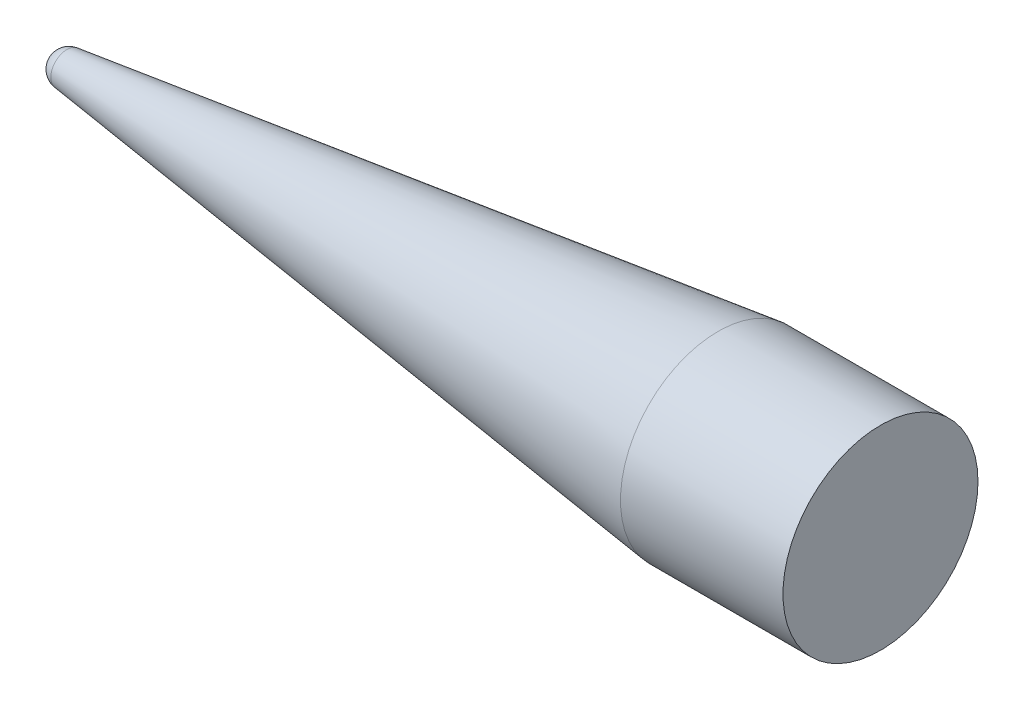
ISO-10303-21;
HEADER;
FILE_DESCRIPTION(('STEP AP214'),'2;1');
FILE_NAME('part.step','',(''),(''),'','','');
FILE_SCHEMA(('AUTOMOTIVE_DESIGN { 1 0 10303 214 1 1 1 1 }'));
ENDSEC;
DATA;
#1=APPLICATION_CONTEXT('core data for automotive mechanical design processes');
#2=APPLICATION_PROTOCOL_DEFINITION('international standard','automotive_design',2000,#1);
#3=PRODUCT_CONTEXT('',#1,'mechanical');
#4=PRODUCT('Part','Part','',(#3));
#5=PRODUCT_RELATED_PRODUCT_CATEGORY('part','',(#4));
#6=PRODUCT_DEFINITION_FORMATION('','',#4);
#7=PRODUCT_DEFINITION_CONTEXT('part definition',#1,'design');
#8=PRODUCT_DEFINITION('design','',#6,#7);
#9=PRODUCT_DEFINITION_SHAPE('','',#8);
#10=(LENGTH_UNIT() NAMED_UNIT(*) SI_UNIT(.MILLI.,.METRE.));
#11=(NAMED_UNIT(*) PLANE_ANGLE_UNIT() SI_UNIT($,.RADIAN.));
#12=(NAMED_UNIT(*) SI_UNIT($,.STERADIAN.) SOLID_ANGLE_UNIT());
#13=UNCERTAINTY_MEASURE_WITH_UNIT(LENGTH_MEASURE(1.E-05),#10,'distance_accuracy_value','');
#14=(GEOMETRIC_REPRESENTATION_CONTEXT(3) GLOBAL_UNCERTAINTY_ASSIGNED_CONTEXT((#13)) GLOBAL_UNIT_ASSIGNED_CONTEXT((#10,
#11,#12)) REPRESENTATION_CONTEXT('',''));
#15=CARTESIAN_POINT('',(0.,0.,0.));
#16=DIRECTION('',(0.,0.,1.));
#17=DIRECTION('',(1.,0.,0.));
#18=AXIS2_PLACEMENT_3D('',#15,#16,#17);
#19=CARTESIAN_POINT('',(609.6,0.,0.));
#20=DIRECTION('',(1.,0.,0.));
#21=DIRECTION('',(0.,0.,-1.));
#22=AXIS2_PLACEMENT_3D('',#19,#20,#21);
#23=CONICAL_SURFACE('',#22,76.2,0.124354994546761);
#24=CARTESIAN_POINT('',(100.815432272876,0.,0.));
#25=DIRECTION('',(1.,0.,0.));
#26=DIRECTION('',(0.,0.,-1.));
#27=AXIS2_PLACEMENT_3D('',#24,#25,#26);
#28=CIRCLE('',#27,12.6019290341095);
#29=CARTESIAN_POINT('',(100.815432272876,0.,-12.6019290341095));
#30=VERTEX_POINT('',#29);
#31=EDGE_CURVE('E37',#30,#30,#28,.T.);
#32=CARTESIAN_POINT('',(609.6,0.,0.));
#33=DIRECTION('',(1.,0.,0.));
#34=DIRECTION('',(0.,0.,-1.));
#35=AXIS2_PLACEMENT_3D('',#32,#33,#34);
#36=CIRCLE('',#35,76.2);
#37=CARTESIAN_POINT('',(609.6,0.,-76.2));
#38=VERTEX_POINT('',#37);
#39=EDGE_CURVE('E10',#38,#38,#36,.T.);
#40=CARTESIAN_POINT('',(100.815432272876,0.,-12.6019290341095));
#41=CARTESIAN_POINT('',(106.115271520034,0.,-13.2644089400042));
#42=CARTESIAN_POINT('',(111.415110767191,0.,-13.9268888458989));
#43=CARTESIAN_POINT('',(122.014789261506,0.,-15.2518486576883));
#44=CARTESIAN_POINT('',(127.314628508664,0.,-15.914328563583));
#45=CARTESIAN_POINT('',(137.914307002979,0.,-17.2392883753724));
#46=CARTESIAN_POINT('',(143.214146250137,0.,-17.9017682812671));
#47=CARTESIAN_POINT('',(153.813824744452,0.,-19.2267280930565));
#48=CARTESIAN_POINT('',(159.113663991609,0.,-19.8892079989511));
#49=CARTESIAN_POINT('',(169.713342485924,0.,-21.2141678107405));
#50=CARTESIAN_POINT('',(175.013181733082,0.,-21.8766477166352));
#51=CARTESIAN_POINT('',(185.612860227397,0.,-23.2016075284246));
#52=CARTESIAN_POINT('',(190.912699474554,0.,-23.8640874343193));
#53=CARTESIAN_POINT('',(201.512377968869,0.,-25.1890472461087));
#54=CARTESIAN_POINT('',(206.812217216027,0.,-25.8515271520034));
#55=CARTESIAN_POINT('',(217.411895710342,0.,-27.1764869637928));
#56=CARTESIAN_POINT('',(222.7117349575,0.,-27.8389668696875));
#57=CARTESIAN_POINT('',(233.311413451815,0.,-29.1639266814768));
#58=CARTESIAN_POINT('',(238.611252698972,0.,-29.8264065873715));
#59=CARTESIAN_POINT('',(249.210931193287,0.,-31.1513663991609));
#60=CARTESIAN_POINT('',(254.510770440445,0.,-31.8138463050556));
#61=CARTESIAN_POINT('',(265.11044893476,0.,-33.138806116845));
#62=CARTESIAN_POINT('',(270.410288181918,0.,-33.8012860227397));
#63=CARTESIAN_POINT('',(281.009966676233,0.,-35.1262458345291));
#64=CARTESIAN_POINT('',(286.30980592339,0.,-35.7887257404238));
#65=CARTESIAN_POINT('',(296.909484417705,0.,-37.1136855522131));
#66=CARTESIAN_POINT('',(302.209323664863,0.,-37.7761654581078));
#67=CARTESIAN_POINT('',(312.809002159178,0.,-39.1011252698972));
#68=CARTESIAN_POINT('',(318.108841406335,0.,-39.7636051757919));
#69=CARTESIAN_POINT('',(328.70851990065,0.,-41.0885649875813));
#70=CARTESIAN_POINT('',(334.008359147808,0.,-41.751044893476));
#71=CARTESIAN_POINT('',(344.608037642123,0.,-43.0760047052654));
#72=CARTESIAN_POINT('',(349.907876889281,0.,-43.7384846111601));
#73=CARTESIAN_POINT('',(360.507555383596,0.,-45.0634444229495));
#74=CARTESIAN_POINT('',(365.807394630753,0.,-45.7259243288441));
#75=CARTESIAN_POINT('',(376.407073125068,0.,-47.0508841406335));
#76=CARTESIAN_POINT('',(381.706912372226,0.,-47.7133640465282));
#77=CARTESIAN_POINT('',(392.306590866541,0.,-49.0383238583176));
#78=CARTESIAN_POINT('',(397.606430113698,0.,-49.7008037642123));
#79=CARTESIAN_POINT('',(408.206108608013,0.,-51.0257635760017));
#80=CARTESIAN_POINT('',(413.505947855171,0.,-51.6882434818964));
#81=CARTESIAN_POINT('',(424.105626349486,0.,-53.0132032936858));
#82=CARTESIAN_POINT('',(429.405465596644,0.,-53.6756831995805));
#83=CARTESIAN_POINT('',(440.005144090959,0.,-55.0006430113698));
#84=CARTESIAN_POINT('',(445.304983338116,0.,-55.6631229172645));
#85=CARTESIAN_POINT('',(455.904661832431,0.,-56.9880827290539));
#86=CARTESIAN_POINT('',(461.204501079589,0.,-57.6505626349486));
#87=CARTESIAN_POINT('',(471.804179573904,0.,-58.975522446738));
#88=CARTESIAN_POINT('',(477.104018821061,0.,-59.6380023526327));
#89=CARTESIAN_POINT('',(487.703697315377,0.,-60.9629621644221));
#90=CARTESIAN_POINT('',(493.003536562534,0.,-61.6254420703168));
#91=CARTESIAN_POINT('',(503.603215056849,0.,-62.9504018821061));
#92=CARTESIAN_POINT('',(508.903054304007,0.,-63.6128817880008));
#93=CARTESIAN_POINT('',(519.502732798322,0.,-64.9378415997902));
#94=CARTESIAN_POINT('',(524.802572045479,0.,-65.6003215056849));
#95=CARTESIAN_POINT('',(535.402250539794,0.,-66.9252813174743));
#96=CARTESIAN_POINT('',(540.702089786952,0.,-67.587761223369));
#97=CARTESIAN_POINT('',(551.301768281267,0.,-68.9127210351584));
#98=CARTESIAN_POINT('',(556.601607528425,0.,-69.5752009410531));
#99=CARTESIAN_POINT('',(567.20128602274,0.,-70.9001607528425));
#100=CARTESIAN_POINT('',(572.501125269897,0.,-71.5626406587372));
#101=CARTESIAN_POINT('',(583.100803764212,0.,-72.8876004705265));
#102=CARTESIAN_POINT('',(588.40064301137,0.,-73.5500803764212));
#103=CARTESIAN_POINT('',(599.000321505685,0.,-74.8750401882106));
#104=CARTESIAN_POINT('',(604.300160752842,0.,-75.5375200941053));
#105=CARTESIAN_POINT('',(609.6,0.,-76.2));
#106=B_SPLINE_CURVE_WITH_KNOTS('',3,(#40,#41,#42,#43,#44,#45,#46,#47,#48,#49,#50,#51,#52,#53,
#54,#55,#56,#57,#58,#59,#60,#61,#62,#63,#64,#65,#66,#67,#68,#69,#70,#71,#72,#73,#74,#75,#76,#77,
#78,#79,#80,#81,#82,#83,#84,#85,#86,#87,#88,#89,#90,#91,#92,#93,#94,#95,#96,#97,#98,#99,#100,
#101,#102,#103,#104,#105),.UNSPECIFIED.,.F.,.F.,(4,2,2,2,2,2,2,2,2,2,2,2,2,2,2,2,2,2,2,2,2,2,2,
2,2,2,2,2,2,2,2,2,4),(0.,16.0232512631748,32.0465025263494,48.0697537895242,64.0930050526989,
80.1162563158736,96.1395075790484,112.162758842223,128.186010105398,144.209261368573,
160.232512631747,176.255763894922,192.279015158097,208.302266421271,224.325517684446,
240.348768947621,256.372020210796,272.39527147397,288.418522737145,304.44177400032,
320.465025263495,336.488276526669,352.511527789844,368.534779053019,384.558030316194,
400.581281579369,416.604532842543,432.627784105718,448.651035368893,464.674286632067,
480.697537895242,496.720789158417,512.744040421592),.UNSPECIFIED.);
#107=EDGE_CURVE('BSEAM31',#30,#38,#106,.T.);
#108=ORIENTED_EDGE('',*,*,#31,.T.);
#109=ORIENTED_EDGE('',*,*,#39,.F.);
#110=ORIENTED_EDGE('',*,*,#107,.T.);
#111=ORIENTED_EDGE('',*,*,#107,.F.);
#112=EDGE_LOOP('',(#108,#110,#109,#111));
#113=FACE_BOUND('',#112,.T.);
#114=ADVANCED_FACE('F31',(#113),#23,.T.);
#115=CARTESIAN_POINT('',(102.39067340214,0.,0.));
#116=DIRECTION('',(1.,0.,0.));
#117=DIRECTION('',(0.,0.,-1.));
#118=AXIS2_PLACEMENT_3D('',#115,#116,#117);
#119=SPHERICAL_SURFACE('',#118,12.6999999998448);
#120=ORIENTED_EDGE('',*,*,#31,.F.);
#121=EDGE_LOOP('',(#120));
#122=FACE_BOUND('',#121,.T.);
#123=ADVANCED_FACE('F52',(#122),#119,.T.);
#124=CARTESIAN_POINT('',(736.6,0.,0.));
#125=DIRECTION('',(-1.,0.,0.));
#126=DIRECTION('',(0.,0.,1.));
#127=AXIS2_PLACEMENT_3D('',#124,#125,#126);
#128=CYLINDRICAL_SURFACE('',#127,76.2);
#129=CARTESIAN_POINT('',(736.6,0.,0.));
#130=DIRECTION('',(1.,0.,0.));
#131=DIRECTION('',(0.,0.,-1.));
#132=AXIS2_PLACEMENT_3D('',#129,#130,#131);
#133=CIRCLE('',#132,76.2);
#134=CARTESIAN_POINT('',(736.6,0.,-76.2));
#135=VERTEX_POINT('',#134);
#136=EDGE_CURVE('E41',#135,#135,#133,.T.);
#137=ORIENTED_EDGE('',*,*,#136,.F.);
#138=EDGE_LOOP('',(#137));
#139=FACE_BOUND('',#138,.T.);
#140=ORIENTED_EDGE('',*,*,#39,.T.);
#141=EDGE_LOOP('',(#140));
#142=FACE_BOUND('',#141,.T.);
#143=ADVANCED_FACE('F50',(#139,#142),#128,.T.);
#144=CARTESIAN_POINT('',(736.6,0.,0.));
#145=DIRECTION('',(1.,0.,0.));
#146=DIRECTION('',(0.,0.,-1.));
#147=AXIS2_PLACEMENT_3D('',#144,#145,#146);
#148=PLANE('',#147);
#149=ORIENTED_EDGE('',*,*,#136,.T.);
#150=EDGE_LOOP('',(#149));
#151=FACE_BOUND('',#150,.T.);
#152=ADVANCED_FACE('F48',(#151),#148,.T.);
#153=CLOSED_SHELL('',(#114,#123,#143,#152));
#154=MANIFOLD_SOLID_BREP('B2',#153);
#155=ADVANCED_BREP_SHAPE_REPRESENTATION('',(#18,#154),#14);
#156=SHAPE_DEFINITION_REPRESENTATION(#9,#155);
ENDSEC;
END-ISO-10303-21;
